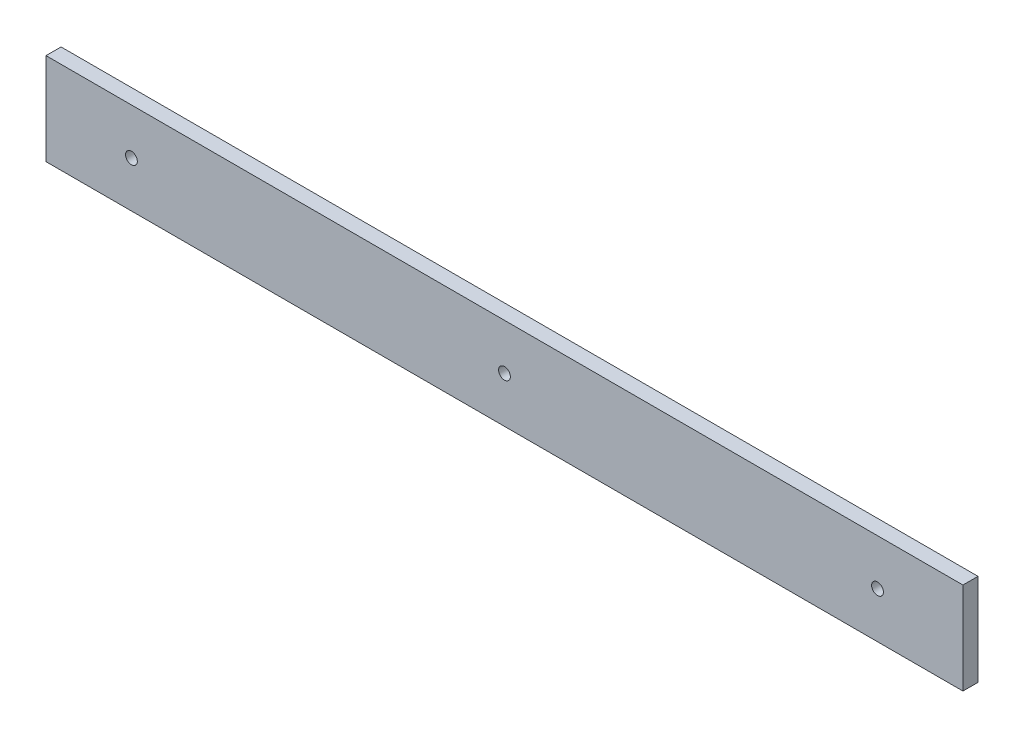
ISO-10303-21;
HEADER;
FILE_DESCRIPTION(('STEP AP214'),'2;1');
FILE_NAME('part.step','',(''),(''),'','','');
FILE_SCHEMA(('AUTOMOTIVE_DESIGN { 1 0 10303 214 1 1 1 1 }'));
ENDSEC;
DATA;
#1=APPLICATION_CONTEXT('core data for automotive mechanical design processes');
#2=APPLICATION_PROTOCOL_DEFINITION('international standard','automotive_design',2000,#1);
#3=PRODUCT_CONTEXT('',#1,'mechanical');
#4=PRODUCT('Part','Part','',(#3));
#5=PRODUCT_RELATED_PRODUCT_CATEGORY('part','',(#4));
#6=PRODUCT_DEFINITION_FORMATION('','',#4);
#7=PRODUCT_DEFINITION_CONTEXT('part definition',#1,'design');
#8=PRODUCT_DEFINITION('design','',#6,#7);
#9=PRODUCT_DEFINITION_SHAPE('','',#8);
#10=(LENGTH_UNIT() NAMED_UNIT(*) SI_UNIT(.MILLI.,.METRE.));
#11=(NAMED_UNIT(*) PLANE_ANGLE_UNIT() SI_UNIT($,.RADIAN.));
#12=(NAMED_UNIT(*) SI_UNIT($,.STERADIAN.) SOLID_ANGLE_UNIT());
#13=UNCERTAINTY_MEASURE_WITH_UNIT(LENGTH_MEASURE(1.E-05),#10,'distance_accuracy_value','');
#14=(GEOMETRIC_REPRESENTATION_CONTEXT(3) GLOBAL_UNCERTAINTY_ASSIGNED_CONTEXT((#13)) GLOBAL_UNIT_ASSIGNED_CONTEXT((#10,
#11,#12)) REPRESENTATION_CONTEXT('',''));
#15=CARTESIAN_POINT('',(0.,0.,0.));
#16=DIRECTION('',(0.,0.,1.));
#17=DIRECTION('',(1.,0.,0.));
#18=AXIS2_PLACEMENT_3D('',#15,#16,#17);
#19=CARTESIAN_POINT('',(0.,0.,1.6002));
#20=DIRECTION('',(-1.,0.,0.));
#21=DIRECTION('',(0.,0.,1.));
#22=AXIS2_PLACEMENT_3D('',#19,#20,#21);
#23=PLANE('',#22);
#24=DIRECTION('',(0.,1.,0.));
#25=VECTOR('',#24,1.);
#26=CARTESIAN_POINT('',(0.,0.,0.));
#27=LINE('',#26,#25);
#28=CARTESIAN_POINT('',(0.,0.,0.));
#29=VERTEX_POINT('',#28);
#30=CARTESIAN_POINT('',(0.,9.757695242,0.));
#31=VERTEX_POINT('',#30);
#32=EDGE_CURVE('E104',#29,#31,#27,.T.);
#33=ORIENTED_EDGE('',*,*,#32,.F.);
#34=DIRECTION('',(0.,0.,-1.));
#35=VECTOR('',#34,1.);
#36=CARTESIAN_POINT('',(0.,0.,1.6002));
#37=LINE('',#36,#35);
#38=CARTESIAN_POINT('',(0.,0.,1.6002));
#39=VERTEX_POINT('',#38);
#40=EDGE_CURVE('E11',#39,#29,#37,.T.);
#41=ORIENTED_EDGE('',*,*,#40,.F.);
#42=DIRECTION('',(0.,1.,0.));
#43=VECTOR('',#42,1.);
#44=CARTESIAN_POINT('',(0.,0.,1.6002));
#45=LINE('',#44,#43);
#46=CARTESIAN_POINT('',(0.,9.757695242,1.6002));
#47=VERTEX_POINT('',#46);
#48=EDGE_CURVE('E98',#39,#47,#45,.T.);
#49=ORIENTED_EDGE('',*,*,#48,.T.);
#50=DIRECTION('',(0.,0.,-1.));
#51=VECTOR('',#50,1.);
#52=CARTESIAN_POINT('',(0.,9.757695242,1.6002));
#53=LINE('',#52,#51);
#54=EDGE_CURVE('E41',#47,#31,#53,.T.);
#55=ORIENTED_EDGE('',*,*,#54,.T.);
#56=EDGE_LOOP('',(#33,#41,#49,#55));
#57=FACE_BOUND('',#56,.T.);
#58=ADVANCED_FACE('F38',(#57),#23,.T.);
#59=CARTESIAN_POINT('',(0.,0.,1.6002));
#60=DIRECTION('',(0.,1.,0.));
#61=DIRECTION('',(0.,0.,1.));
#62=AXIS2_PLACEMENT_3D('',#59,#60,#61);
#63=PLANE('',#62);
#64=DIRECTION('',(1.,0.,0.));
#65=VECTOR('',#64,1.);
#66=CARTESIAN_POINT('',(0.,0.,0.));
#67=LINE('',#66,#65);
#68=CARTESIAN_POINT('',(97.398000022,0.,0.));
#69=VERTEX_POINT('',#68);
#70=EDGE_CURVE('E71',#29,#69,#67,.T.);
#71=ORIENTED_EDGE('',*,*,#70,.T.);
#72=DIRECTION('',(0.,0.,-1.));
#73=VECTOR('',#72,1.);
#74=CARTESIAN_POINT('',(97.398000022,0.,1.6002));
#75=LINE('',#74,#73);
#76=CARTESIAN_POINT('',(97.398000022,0.,1.6002));
#77=VERTEX_POINT('',#76);
#78=EDGE_CURVE('E47',#77,#69,#75,.T.);
#79=ORIENTED_EDGE('',*,*,#78,.F.);
#80=DIRECTION('',(1.,0.,0.));
#81=VECTOR('',#80,1.);
#82=CARTESIAN_POINT('',(0.,0.,1.6002));
#83=LINE('',#82,#81);
#84=EDGE_CURVE('E88',#39,#77,#83,.T.);
#85=ORIENTED_EDGE('',*,*,#84,.F.);
#86=ORIENTED_EDGE('',*,*,#40,.T.);
#87=EDGE_LOOP('',(#71,#79,#85,#86));
#88=FACE_BOUND('',#87,.T.);
#89=ADVANCED_FACE('F115',(#88),#63,.F.);
#90=CARTESIAN_POINT('',(97.398000022,0.,1.6002));
#91=DIRECTION('',(-1.,0.,0.));
#92=DIRECTION('',(0.,0.,1.));
#93=AXIS2_PLACEMENT_3D('',#90,#91,#92);
#94=PLANE('',#93);
#95=DIRECTION('',(0.,1.,0.));
#96=VECTOR('',#95,1.);
#97=CARTESIAN_POINT('',(97.398000022,0.,0.));
#98=LINE('',#97,#96);
#99=CARTESIAN_POINT('',(97.398000022,9.757695242,0.));
#100=VERTEX_POINT('',#99);
#101=EDGE_CURVE('E95',#69,#100,#98,.T.);
#102=ORIENTED_EDGE('',*,*,#101,.T.);
#103=DIRECTION('',(0.,0.,-1.));
#104=VECTOR('',#103,1.);
#105=CARTESIAN_POINT('',(97.398000022,9.757695242,1.6002));
#106=LINE('',#105,#104);
#107=CARTESIAN_POINT('',(97.398000022,9.757695242,1.6002));
#108=VERTEX_POINT('',#107);
#109=EDGE_CURVE('E92',#108,#100,#106,.T.);
#110=ORIENTED_EDGE('',*,*,#109,.F.);
#111=DIRECTION('',(0.,1.,0.));
#112=VECTOR('',#111,1.);
#113=CARTESIAN_POINT('',(97.398000022,0.,1.6002));
#114=LINE('',#113,#112);
#115=EDGE_CURVE('E83',#77,#108,#114,.T.);
#116=ORIENTED_EDGE('',*,*,#115,.F.);
#117=ORIENTED_EDGE('',*,*,#78,.T.);
#118=EDGE_LOOP('',(#102,#110,#116,#117));
#119=FACE_BOUND('',#118,.T.);
#120=ADVANCED_FACE('F93',(#119),#94,.F.);
#121=CARTESIAN_POINT('',(0.,9.757695242,1.6002));
#122=DIRECTION('',(0.,1.,0.));
#123=DIRECTION('',(0.,0.,1.));
#124=AXIS2_PLACEMENT_3D('',#121,#122,#123);
#125=PLANE('',#124);
#126=DIRECTION('',(1.,0.,0.));
#127=VECTOR('',#126,1.);
#128=CARTESIAN_POINT('',(0.,9.757695242,0.));
#129=LINE('',#128,#127);
#130=EDGE_CURVE('E107',#31,#100,#129,.T.);
#131=ORIENTED_EDGE('',*,*,#130,.F.);
#132=ORIENTED_EDGE('',*,*,#54,.F.);
#133=DIRECTION('',(1.,0.,0.));
#134=VECTOR('',#133,1.);
#135=CARTESIAN_POINT('',(0.,9.757695242,1.6002));
#136=LINE('',#135,#134);
#137=EDGE_CURVE('E87',#47,#108,#136,.T.);
#138=ORIENTED_EDGE('',*,*,#137,.T.);
#139=ORIENTED_EDGE('',*,*,#109,.T.);
#140=EDGE_LOOP('',(#131,#132,#138,#139));
#141=FACE_BOUND('',#140,.T.);
#142=ADVANCED_FACE('F97',(#141),#125,.T.);
#143=CARTESIAN_POINT('',(0.,0.,1.6002));
#144=DIRECTION('',(0.,0.,-1.));
#145=DIRECTION('',(-1.,0.,0.));
#146=AXIS2_PLACEMENT_3D('',#143,#144,#145);
#147=PLANE('',#146);
#148=CARTESIAN_POINT('',(9.074999884,4.878847621,1.6002));
#149=DIRECTION('',(0.,0.,1.));
#150=DIRECTION('',(1.,0.,0.));
#151=AXIS2_PLACEMENT_3D('',#148,#149,#150);
#152=CIRCLE('',#151,0.625000000000001);
#153=CARTESIAN_POINT('',(9.699999884,4.878847621,1.6002));
#154=VERTEX_POINT('',#153);
#155=EDGE_CURVE('E155',#154,#154,#152,.T.);
#156=ORIENTED_EDGE('',*,*,#155,.F.);
#157=EDGE_LOOP('',(#156));
#158=FACE_BOUND('',#157,.T.);
#159=CARTESIAN_POINT('',(48.698999884,4.878847621,1.6002));
#160=DIRECTION('',(0.,0.,1.));
#161=DIRECTION('',(1.,0.,0.));
#162=AXIS2_PLACEMENT_3D('',#159,#160,#161);
#163=CIRCLE('',#162,0.624999999999999);
#164=CARTESIAN_POINT('',(49.323999884,4.878847621,1.6002));
#165=VERTEX_POINT('',#164);
#166=EDGE_CURVE('E160',#165,#165,#163,.T.);
#167=ORIENTED_EDGE('',*,*,#166,.F.);
#168=EDGE_LOOP('',(#167));
#169=FACE_BOUND('',#168,.T.);
#170=CARTESIAN_POINT('',(88.323000138,4.878847621,1.6002));
#171=DIRECTION('',(0.,0.,1.));
#172=DIRECTION('',(1.,0.,0.));
#173=AXIS2_PLACEMENT_3D('',#170,#171,#172);
#174=CIRCLE('',#173,0.625000000000006);
#175=CARTESIAN_POINT('',(88.948000138,4.878847621,1.6002));
#176=VERTEX_POINT('',#175);
#177=EDGE_CURVE('E167',#176,#176,#174,.T.);
#178=ORIENTED_EDGE('',*,*,#177,.F.);
#179=EDGE_LOOP('',(#178));
#180=FACE_BOUND('',#179,.T.);
#181=ORIENTED_EDGE('',*,*,#48,.F.);
#182=ORIENTED_EDGE('',*,*,#84,.T.);
#183=ORIENTED_EDGE('',*,*,#115,.T.);
#184=ORIENTED_EDGE('',*,*,#137,.F.);
#185=EDGE_LOOP('',(#181,#182,#183,#184));
#186=FACE_BOUND('',#185,.T.);
#187=ADVANCED_FACE('F86',(#158,#169,#180,#186),#147,.F.);
#188=CARTESIAN_POINT('',(0.,0.,0.));
#189=DIRECTION('',(0.,0.,-1.));
#190=DIRECTION('',(-1.,0.,0.));
#191=AXIS2_PLACEMENT_3D('',#188,#189,#190);
#192=PLANE('',#191);
#193=CARTESIAN_POINT('',(9.074999884,4.878847621,0.));
#194=DIRECTION('',(0.,0.,1.));
#195=DIRECTION('',(1.,0.,0.));
#196=AXIS2_PLACEMENT_3D('',#193,#194,#195);
#197=CIRCLE('',#196,0.625000000000001);
#198=CARTESIAN_POINT('',(9.699999884,4.878847621,0.));
#199=VERTEX_POINT('',#198);
#200=EDGE_CURVE('E108',#199,#199,#197,.T.);
#201=ORIENTED_EDGE('',*,*,#200,.T.);
#202=EDGE_LOOP('',(#201));
#203=FACE_BOUND('',#202,.T.);
#204=CARTESIAN_POINT('',(48.698999884,4.878847621,0.));
#205=DIRECTION('',(0.,0.,1.));
#206=DIRECTION('',(1.,0.,0.));
#207=AXIS2_PLACEMENT_3D('',#204,#205,#206);
#208=CIRCLE('',#207,0.624999999999999);
#209=CARTESIAN_POINT('',(49.323999884,4.878847621,0.));
#210=VERTEX_POINT('',#209);
#211=EDGE_CURVE('E156',#210,#210,#208,.T.);
#212=ORIENTED_EDGE('',*,*,#211,.T.);
#213=EDGE_LOOP('',(#212));
#214=FACE_BOUND('',#213,.T.);
#215=CARTESIAN_POINT('',(88.323000138,4.878847621,0.));
#216=DIRECTION('',(0.,0.,1.));
#217=DIRECTION('',(1.,0.,0.));
#218=AXIS2_PLACEMENT_3D('',#215,#216,#217);
#219=CIRCLE('',#218,0.625000000000006);
#220=CARTESIAN_POINT('',(88.948000138,4.878847621,0.));
#221=VERTEX_POINT('',#220);
#222=EDGE_CURVE('E165',#221,#221,#219,.T.);
#223=ORIENTED_EDGE('',*,*,#222,.T.);
#224=EDGE_LOOP('',(#223));
#225=FACE_BOUND('',#224,.T.);
#226=ORIENTED_EDGE('',*,*,#32,.T.);
#227=ORIENTED_EDGE('',*,*,#130,.T.);
#228=ORIENTED_EDGE('',*,*,#101,.F.);
#229=ORIENTED_EDGE('',*,*,#70,.F.);
#230=EDGE_LOOP('',(#226,#227,#228,#229));
#231=FACE_BOUND('',#230,.T.);
#232=ADVANCED_FACE('F113',(#203,#214,#225,#231),#192,.T.);
#233=CARTESIAN_POINT('',(88.323000138,4.878847621,0.));
#234=DIRECTION('',(0.,0.,1.));
#235=DIRECTION('',(1.,0.,0.));
#236=AXIS2_PLACEMENT_3D('',#233,#234,#235);
#237=CYLINDRICAL_SURFACE('',#236,0.625000000000006);
#238=ORIENTED_EDGE('',*,*,#222,.F.);
#239=EDGE_LOOP('',(#238));
#240=FACE_BOUND('',#239,.T.);
#241=ORIENTED_EDGE('',*,*,#177,.T.);
#242=EDGE_LOOP('',(#241));
#243=FACE_BOUND('',#242,.T.);
#244=ADVANCED_FACE('F134',(#240,#243),#237,.F.);
#245=CARTESIAN_POINT('',(48.698999884,4.878847621,0.));
#246=DIRECTION('',(0.,0.,1.));
#247=DIRECTION('',(1.,0.,0.));
#248=AXIS2_PLACEMENT_3D('',#245,#246,#247);
#249=CYLINDRICAL_SURFACE('',#248,0.624999999999999);
#250=ORIENTED_EDGE('',*,*,#211,.F.);
#251=EDGE_LOOP('',(#250));
#252=FACE_BOUND('',#251,.T.);
#253=ORIENTED_EDGE('',*,*,#166,.T.);
#254=EDGE_LOOP('',(#253));
#255=FACE_BOUND('',#254,.T.);
#256=ADVANCED_FACE('F141',(#252,#255),#249,.F.);
#257=CARTESIAN_POINT('',(9.074999884,4.878847621,0.));
#258=DIRECTION('',(0.,0.,1.));
#259=DIRECTION('',(1.,0.,0.));
#260=AXIS2_PLACEMENT_3D('',#257,#258,#259);
#261=CYLINDRICAL_SURFACE('',#260,0.625000000000001);
#262=ORIENTED_EDGE('',*,*,#200,.F.);
#263=EDGE_LOOP('',(#262));
#264=FACE_BOUND('',#263,.T.);
#265=ORIENTED_EDGE('',*,*,#155,.T.);
#266=EDGE_LOOP('',(#265));
#267=FACE_BOUND('',#266,.T.);
#268=ADVANCED_FACE('F145',(#264,#267),#261,.F.);
#269=CLOSED_SHELL('',(#58,#89,#120,#142,#187,#232,#244,#256,#268));
#270=MANIFOLD_SOLID_BREP('B2',#269);
#271=ADVANCED_BREP_SHAPE_REPRESENTATION('',(#18,#270),#14);
#272=SHAPE_DEFINITION_REPRESENTATION(#9,#271);
ENDSEC;
END-ISO-10303-21;
